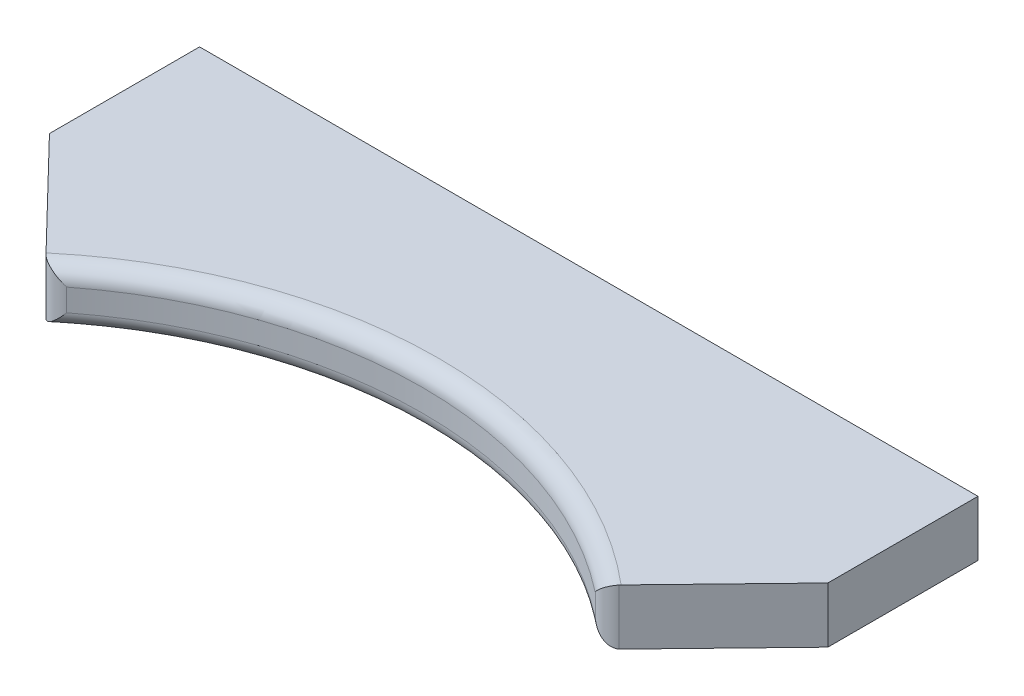
ISO-10303-21;
HEADER;
FILE_DESCRIPTION(('STEP AP214'),'2;1');
FILE_NAME('part.step','',(''),(''),'','','');
FILE_SCHEMA(('AUTOMOTIVE_DESIGN { 1 0 10303 214 1 1 1 1 }'));
ENDSEC;
DATA;
#1=APPLICATION_CONTEXT('core data for automotive mechanical design processes');
#2=APPLICATION_PROTOCOL_DEFINITION('international standard','automotive_design',2000,#1);
#3=PRODUCT_CONTEXT('',#1,'mechanical');
#4=PRODUCT('Part','Part','',(#3));
#5=PRODUCT_RELATED_PRODUCT_CATEGORY('part','',(#4));
#6=PRODUCT_DEFINITION_FORMATION('','',#4);
#7=PRODUCT_DEFINITION_CONTEXT('part definition',#1,'design');
#8=PRODUCT_DEFINITION('design','',#6,#7);
#9=PRODUCT_DEFINITION_SHAPE('','',#8);
#10=(LENGTH_UNIT() NAMED_UNIT(*) SI_UNIT(.MILLI.,.METRE.));
#11=(NAMED_UNIT(*) PLANE_ANGLE_UNIT() SI_UNIT($,.RADIAN.));
#12=(NAMED_UNIT(*) SI_UNIT($,.STERADIAN.) SOLID_ANGLE_UNIT());
#13=UNCERTAINTY_MEASURE_WITH_UNIT(LENGTH_MEASURE(1.E-05),#10,'distance_accuracy_value','');
#14=(GEOMETRIC_REPRESENTATION_CONTEXT(3) GLOBAL_UNCERTAINTY_ASSIGNED_CONTEXT((#13)) GLOBAL_UNIT_ASSIGNED_CONTEXT((#10,
#11,#12)) REPRESENTATION_CONTEXT('',''));
#15=CARTESIAN_POINT('',(0.,0.,0.));
#16=DIRECTION('',(0.,0.,1.));
#17=DIRECTION('',(1.,0.,0.));
#18=AXIS2_PLACEMENT_3D('',#15,#16,#17);
#19=CARTESIAN_POINT('',(-44.45,6.35,-68.072));
#20=DIRECTION('',(1.,0.,0.));
#21=DIRECTION('',(0.,0.,-1.));
#22=AXIS2_PLACEMENT_3D('',#19,#20,#21);
#23=PLANE('',#22);
#24=DIRECTION('',(0.,0.,1.));
#25=VECTOR('',#24,1.);
#26=CARTESIAN_POINT('',(-44.45,0.,-68.072));
#27=LINE('',#26,#25);
#28=CARTESIAN_POINT('',(-44.45,0.,-68.072));
#29=VERTEX_POINT('',#28);
#30=CARTESIAN_POINT('',(-44.45,0.,-50.927));
#31=VERTEX_POINT('',#30);
#32=EDGE_CURVE('E143',#29,#31,#27,.T.);
#33=ORIENTED_EDGE('',*,*,#32,.T.);
#34=DIRECTION('',(0.,-1.,0.));
#35=VECTOR('',#34,1.);
#36=CARTESIAN_POINT('',(-44.45,6.35,-50.927));
#37=LINE('',#36,#35);
#38=CARTESIAN_POINT('',(-44.45,6.35,-50.927));
#39=VERTEX_POINT('',#38);
#40=EDGE_CURVE('E124',#39,#31,#37,.T.);
#41=ORIENTED_EDGE('',*,*,#40,.F.);
#42=DIRECTION('',(0.,0.,1.));
#43=VECTOR('',#42,1.);
#44=CARTESIAN_POINT('',(-44.45,6.35,-68.072));
#45=LINE('',#44,#43);
#46=CARTESIAN_POINT('',(-44.45,6.35,-68.072));
#47=VERTEX_POINT('',#46);
#48=EDGE_CURVE('E131',#47,#39,#45,.T.);
#49=ORIENTED_EDGE('',*,*,#48,.F.);
#50=DIRECTION('',(0.,-1.,0.));
#51=VECTOR('',#50,1.);
#52=CARTESIAN_POINT('',(-44.45,6.35,-68.072));
#53=LINE('',#52,#51);
#54=EDGE_CURVE('E265',#47,#29,#53,.T.);
#55=ORIENTED_EDGE('',*,*,#54,.T.);
#56=EDGE_LOOP('',(#33,#41,#49,#55));
#57=FACE_BOUND('',#56,.T.);
#58=ADVANCED_FACE('F39',(#57),#23,.F.);
#59=CARTESIAN_POINT('',(-44.45,6.35,-50.927));
#60=DIRECTION('',(0.718690357158242,0.,-0.695330260040334));
#61=DIRECTION('',(-0.695330260040334,0.,-0.718690357158242));
#62=AXIS2_PLACEMENT_3D('',#59,#60,#61);
#63=PLANE('',#62);
#64=DIRECTION('',(0.695330260040334,0.,0.718690357158242));
#65=VECTOR('',#64,1.);
#66=CARTESIAN_POINT('',(-44.45,0.,-50.927));
#67=LINE('',#66,#65);
#68=CARTESIAN_POINT('',(-32.8385355418874,0.,-38.9254404273631));
#69=VERTEX_POINT('',#68);
#70=EDGE_CURVE('E252',#31,#69,#67,.T.);
#71=ORIENTED_EDGE('',*,*,#70,.T.);
#72=CARTESIAN_POINT('',(-32.8385355418874,0.,-38.9254404273631));
#73=CARTESIAN_POINT('',(-32.8192723699175,5.6676678392526E-07,-38.9055300959154));
#74=CARTESIAN_POINT('',(-32.8000273182367,0.000601240827206942,-38.8856384935203));
#75=CARTESIAN_POINT('',(-32.7615734555909,0.00300280352674082,-38.8458927469776));
#76=CARTESIAN_POINT('',(-32.7423646446257,0.0048036921572654,-38.8260386028297));
#77=CARTESIAN_POINT('',(-32.7231739539493,0.00720468807284279,-38.8062031877343));
#78=B_SPLINE_CURVE_WITH_KNOTS('',3,(#72,#73,#74,#75,#76,#77),.UNSPECIFIED.,.F.,.F.,(4,2,4),(0.,
0.0830522608019308,0.166104521009709),.UNSPECIFIED.);
#79=CARTESIAN_POINT('',(-32.7231739539493,0.00720468807284286,-38.8062031877343));
#80=VERTEX_POINT('',#79);
#81=EDGE_CURVE('E61',#69,#80,#78,.T.);
#82=ORIENTED_EDGE('',*,*,#81,.T.);
#83=DIRECTION('',(0.,-1.,0.));
#84=VECTOR('',#83,1.);
#85=CARTESIAN_POINT('',(-32.7231739539493,6.35,-38.8062031877343));
#86=LINE('',#85,#84);
#87=CARTESIAN_POINT('',(-32.7231739539493,6.34279531192716,-38.8062031877343));
#88=VERTEX_POINT('',#87);
#89=EDGE_CURVE('E65',#80,#88,#86,.F.);
#90=ORIENTED_EDGE('',*,*,#89,.T.);
#91=CARTESIAN_POINT('',(-32.7231739539493,6.34279531192716,-38.8062031877343));
#92=CARTESIAN_POINT('',(-32.7423646446257,6.34519630784273,-38.8260386028297));
#93=CARTESIAN_POINT('',(-32.7615734555909,6.34699719647326,-38.8458927469776));
#94=CARTESIAN_POINT('',(-32.8000273182367,6.34939875917279,-38.8856384935203));
#95=CARTESIAN_POINT('',(-32.8192723699175,6.34999943323322,-38.9055300959154));
#96=CARTESIAN_POINT('',(-32.8385355418874,6.35,-38.9254404273631));
#97=B_SPLINE_CURVE_WITH_KNOTS('',3,(#91,#92,#93,#94,#95,#96),.UNSPECIFIED.,.F.,.F.,(4,2,4),(0.,
0.0830522602077737,0.166104521009704),.UNSPECIFIED.);
#98=CARTESIAN_POINT('',(-32.8385355418874,6.35,-38.9254404273631));
#99=VERTEX_POINT('',#98);
#100=EDGE_CURVE('E127',#88,#99,#97,.T.);
#101=ORIENTED_EDGE('',*,*,#100,.T.);
#102=DIRECTION('',(0.695330260040334,0.,0.718690357158242));
#103=VECTOR('',#102,1.);
#104=CARTESIAN_POINT('',(-44.45,6.35,-50.927));
#105=LINE('',#104,#103);
#106=EDGE_CURVE('E120',#39,#99,#105,.T.);
#107=ORIENTED_EDGE('',*,*,#106,.F.);
#108=ORIENTED_EDGE('',*,*,#40,.T.);
#109=EDGE_LOOP('',(#71,#82,#90,#101,#107,#108));
#110=FACE_BOUND('',#109,.T.);
#111=ADVANCED_FACE('F122',(#110),#63,.F.);
#112=CARTESIAN_POINT('',(0.,6.35,0.));
#113=DIRECTION('',(0.,-1.,0.));
#114=DIRECTION('',(0.,0.,-1.));
#115=AXIS2_PLACEMENT_3D('',#112,#113,#114);
#116=CYLINDRICAL_SURFACE('',#115,49.022);
#117=DIRECTION('',(0.,-1.,0.));
#118=VECTOR('',#117,1.);
#119=CARTESIAN_POINT('',(-30.1812233563473,6.35,-38.6296549391045));
#120=LINE('',#119,#118);
#121=CARTESIAN_POINT('',(-30.1812233563472,4.445,-38.6296549391045));
#122=VERTEX_POINT('',#121);
#123=CARTESIAN_POINT('',(-30.1812233563472,1.905,-38.6296549391045));
#124=VERTEX_POINT('',#123);
#125=EDGE_CURVE('E232',#122,#124,#120,.T.);
#126=ORIENTED_EDGE('',*,*,#125,.T.);
#127=CARTESIAN_POINT('',(0.,1.905,0.));
#128=DIRECTION('',(0.,1.,0.));
#129=DIRECTION('',(0.,0.,1.));
#130=AXIS2_PLACEMENT_3D('',#127,#128,#129);
#131=CIRCLE('',#130,49.022);
#132=CARTESIAN_POINT('',(30.1812233563472,1.905,-38.6296549391045));
#133=VERTEX_POINT('',#132);
#134=EDGE_CURVE('E233',#124,#133,#131,.F.);
#135=ORIENTED_EDGE('',*,*,#134,.T.);
#136=DIRECTION('',(0.,-1.,0.));
#137=VECTOR('',#136,1.);
#138=CARTESIAN_POINT('',(30.1812233563472,6.35,-38.6296549391045));
#139=LINE('',#138,#137);
#140=CARTESIAN_POINT('',(30.1812233563472,4.445,-38.6296549391045));
#141=VERTEX_POINT('',#140);
#142=EDGE_CURVE('E221',#133,#141,#139,.F.);
#143=ORIENTED_EDGE('',*,*,#142,.T.);
#144=CARTESIAN_POINT('',(0.,4.445,0.));
#145=DIRECTION('',(0.,1.,0.));
#146=DIRECTION('',(0.,0.,1.));
#147=AXIS2_PLACEMENT_3D('',#144,#145,#146);
#148=CIRCLE('',#147,49.022);
#149=EDGE_CURVE('E181',#141,#122,#148,.T.);
#150=ORIENTED_EDGE('',*,*,#149,.T.);
#151=EDGE_LOOP('',(#126,#135,#143,#150));
#152=FACE_BOUND('',#151,.T.);
#153=ADVANCED_FACE('F169',(#152),#116,.F.);
#154=CARTESIAN_POINT('',(44.45,6.35,-50.927));
#155=DIRECTION('',(-0.718690357158241,0.,-0.695330260040335));
#156=DIRECTION('',(-0.695330260040335,0.,0.718690357158241));
#157=AXIS2_PLACEMENT_3D('',#154,#155,#156);
#158=PLANE('',#157);
#159=DIRECTION('',(0.,-1.,0.));
#160=VECTOR('',#159,1.);
#161=CARTESIAN_POINT('',(32.7231739539492,6.35,-38.8062031877343));
#162=LINE('',#161,#160);
#163=CARTESIAN_POINT('',(32.7231739539492,6.34279531192716,-38.8062031877343));
#164=VERTEX_POINT('',#163);
#165=CARTESIAN_POINT('',(32.7231739539492,0.00720468807284286,-38.8062031877343));
#166=VERTEX_POINT('',#165);
#167=EDGE_CURVE('E147',#164,#166,#162,.T.);
#168=ORIENTED_EDGE('',*,*,#167,.T.);
#169=CARTESIAN_POINT('',(32.7231739539492,0.00720468807284286,-38.8062031877343));
#170=CARTESIAN_POINT('',(32.7423646446256,0.00480369215726555,-38.8260386028297));
#171=CARTESIAN_POINT('',(32.7615734555909,0.00300280352674097,-38.8458927469776));
#172=CARTESIAN_POINT('',(32.8000273182367,0.000601240827206877,-38.8856384935203));
#173=CARTESIAN_POINT('',(32.8192723699175,5.66766783722193E-07,-38.9055300959154));
#174=CARTESIAN_POINT('',(32.8385355418874,0.,-38.9254404273631));
#175=B_SPLINE_CURVE_WITH_KNOTS('',3,(#169,#170,#171,#172,#173,#174),.UNSPECIFIED.,.F.,.F.,(4,2,
4),(0.,0.0830522602077737,0.166104521009705),.UNSPECIFIED.);
#176=CARTESIAN_POINT('',(32.8385355418874,0.,-38.9254404273631));
#177=VERTEX_POINT('',#176);
#178=EDGE_CURVE('E174',#166,#177,#175,.T.);
#179=ORIENTED_EDGE('',*,*,#178,.T.);
#180=DIRECTION('',(0.695330260040335,0.,-0.718690357158241));
#181=VECTOR('',#180,1.);
#182=CARTESIAN_POINT('',(44.45,0.,-50.927));
#183=LINE('',#182,#181);
#184=CARTESIAN_POINT('',(44.45,0.,-50.927));
#185=VERTEX_POINT('',#184);
#186=EDGE_CURVE('E254',#177,#185,#183,.T.);
#187=ORIENTED_EDGE('',*,*,#186,.T.);
#188=DIRECTION('',(0.,-1.,0.));
#189=VECTOR('',#188,1.);
#190=CARTESIAN_POINT('',(44.45,6.35,-50.927));
#191=LINE('',#190,#189);
#192=CARTESIAN_POINT('',(44.45,6.35,-50.927));
#193=VERTEX_POINT('',#192);
#194=EDGE_CURVE('E145',#193,#185,#191,.T.);
#195=ORIENTED_EDGE('',*,*,#194,.F.);
#196=DIRECTION('',(0.695330260040335,0.,-0.718690357158241));
#197=VECTOR('',#196,1.);
#198=CARTESIAN_POINT('',(44.45,6.35,-50.927));
#199=LINE('',#198,#197);
#200=CARTESIAN_POINT('',(32.8385355418874,6.35,-38.9254404273631));
#201=VERTEX_POINT('',#200);
#202=EDGE_CURVE('E130',#201,#193,#199,.T.);
#203=ORIENTED_EDGE('',*,*,#202,.F.);
#204=CARTESIAN_POINT('',(32.8385355418874,6.35,-38.9254404273631));
#205=CARTESIAN_POINT('',(32.8192723699175,6.34999943323322,-38.9055300959154));
#206=CARTESIAN_POINT('',(32.8000273182367,6.34939875917279,-38.8856384935203));
#207=CARTESIAN_POINT('',(32.7615734555909,6.34699719647326,-38.8458927469776));
#208=CARTESIAN_POINT('',(32.7423646446256,6.34519630784273,-38.8260386028297));
#209=CARTESIAN_POINT('',(32.7231739539492,6.34279531192716,-38.8062031877343));
#210=B_SPLINE_CURVE_WITH_KNOTS('',3,(#204,#205,#206,#207,#208,#209),.UNSPECIFIED.,.F.,.F.,(4,2,
4),(0.,0.0830522608019308,0.166104521009705),.UNSPECIFIED.);
#211=EDGE_CURVE('E144',#201,#164,#210,.T.);
#212=ORIENTED_EDGE('',*,*,#211,.T.);
#213=EDGE_LOOP('',(#168,#179,#187,#195,#203,#212));
#214=FACE_BOUND('',#213,.T.);
#215=ADVANCED_FACE('F163',(#214),#158,.F.);
#216=CARTESIAN_POINT('',(44.45,6.35,-68.072));
#217=DIRECTION('',(-1.,0.,0.));
#218=DIRECTION('',(0.,0.,1.));
#219=AXIS2_PLACEMENT_3D('',#216,#217,#218);
#220=PLANE('',#219);
#221=DIRECTION('',(0.,0.,-1.));
#222=VECTOR('',#221,1.);
#223=CARTESIAN_POINT('',(44.45,0.,-68.072));
#224=LINE('',#223,#222);
#225=CARTESIAN_POINT('',(44.45,0.,-68.072));
#226=VERTEX_POINT('',#225);
#227=EDGE_CURVE('E270',#185,#226,#224,.T.);
#228=ORIENTED_EDGE('',*,*,#227,.T.);
#229=DIRECTION('',(0.,-1.,0.));
#230=VECTOR('',#229,1.);
#231=CARTESIAN_POINT('',(44.45,6.35,-68.072));
#232=LINE('',#231,#230);
#233=CARTESIAN_POINT('',(44.45,6.35,-68.072));
#234=VERTEX_POINT('',#233);
#235=EDGE_CURVE('E150',#234,#226,#232,.T.);
#236=ORIENTED_EDGE('',*,*,#235,.F.);
#237=DIRECTION('',(0.,0.,-1.));
#238=VECTOR('',#237,1.);
#239=CARTESIAN_POINT('',(44.45,6.35,-68.072));
#240=LINE('',#239,#238);
#241=EDGE_CURVE('E259',#193,#234,#240,.T.);
#242=ORIENTED_EDGE('',*,*,#241,.F.);
#243=ORIENTED_EDGE('',*,*,#194,.T.);
#244=EDGE_LOOP('',(#228,#236,#242,#243));
#245=FACE_BOUND('',#244,.T.);
#246=ADVANCED_FACE('F168',(#245),#220,.F.);
#247=CARTESIAN_POINT('',(-44.45,6.35,-68.072));
#248=DIRECTION('',(0.,0.,1.));
#249=DIRECTION('',(1.,0.,0.));
#250=AXIS2_PLACEMENT_3D('',#247,#248,#249);
#251=PLANE('',#250);
#252=DIRECTION('',(-1.,0.,0.));
#253=VECTOR('',#252,1.);
#254=CARTESIAN_POINT('',(-44.45,0.,-68.072));
#255=LINE('',#254,#253);
#256=EDGE_CURVE('E140',#226,#29,#255,.T.);
#257=ORIENTED_EDGE('',*,*,#256,.T.);
#258=ORIENTED_EDGE('',*,*,#54,.F.);
#259=DIRECTION('',(-1.,0.,0.));
#260=VECTOR('',#259,1.);
#261=CARTESIAN_POINT('',(-44.45,6.35,-68.072));
#262=LINE('',#261,#260);
#263=EDGE_CURVE('E136',#234,#47,#262,.T.);
#264=ORIENTED_EDGE('',*,*,#263,.F.);
#265=ORIENTED_EDGE('',*,*,#235,.T.);
#266=EDGE_LOOP('',(#257,#258,#264,#265));
#267=FACE_BOUND('',#266,.T.);
#268=ADVANCED_FACE('F275',(#267),#251,.F.);
#269=CARTESIAN_POINT('',(0.,6.35,0.));
#270=DIRECTION('',(0.,1.,0.));
#271=DIRECTION('',(0.,0.,1.));
#272=AXIS2_PLACEMENT_3D('',#269,#270,#271);
#273=PLANE('',#272);
#274=ORIENTED_EDGE('',*,*,#106,.T.);
#275=CARTESIAN_POINT('',(0.,6.35,0.));
#276=DIRECTION('',(0.,1.,0.));
#277=DIRECTION('',(0.,0.,1.));
#278=AXIS2_PLACEMENT_3D('',#275,#276,#277);
#279=CIRCLE('',#278,50.927);
#280=EDGE_CURVE('E11',#99,#201,#279,.F.);
#281=ORIENTED_EDGE('',*,*,#280,.T.);
#282=ORIENTED_EDGE('',*,*,#202,.T.);
#283=ORIENTED_EDGE('',*,*,#241,.T.);
#284=ORIENTED_EDGE('',*,*,#263,.T.);
#285=ORIENTED_EDGE('',*,*,#48,.T.);
#286=EDGE_LOOP('',(#274,#281,#282,#283,#284,#285));
#287=FACE_BOUND('',#286,.T.);
#288=ADVANCED_FACE('F134',(#287),#273,.T.);
#289=CARTESIAN_POINT('',(0.,0.,0.));
#290=DIRECTION('',(0.,1.,0.));
#291=DIRECTION('',(0.,0.,1.));
#292=AXIS2_PLACEMENT_3D('',#289,#290,#291);
#293=PLANE('',#292);
#294=ORIENTED_EDGE('',*,*,#186,.F.);
#295=CARTESIAN_POINT('',(0.,0.,0.));
#296=DIRECTION('',(0.,1.,0.));
#297=DIRECTION('',(0.,0.,1.));
#298=AXIS2_PLACEMENT_3D('',#295,#296,#297);
#299=CIRCLE('',#298,50.927);
#300=EDGE_CURVE('E53',#177,#69,#299,.T.);
#301=ORIENTED_EDGE('',*,*,#300,.T.);
#302=ORIENTED_EDGE('',*,*,#70,.F.);
#303=ORIENTED_EDGE('',*,*,#32,.F.);
#304=ORIENTED_EDGE('',*,*,#256,.F.);
#305=ORIENTED_EDGE('',*,*,#227,.F.);
#306=EDGE_LOOP('',(#294,#301,#302,#303,#304,#305));
#307=FACE_BOUND('',#306,.T.);
#308=ADVANCED_FACE('F251',(#307),#293,.F.);
#309=CARTESIAN_POINT('',(-31.3540688235628,6.35,-40.1308073331111));
#310=DIRECTION('',(0.,-1.,0.));
#311=DIRECTION('',(0.,0.,-1.));
#312=AXIS2_PLACEMENT_3D('',#309,#310,#311);
#313=CYLINDRICAL_SURFACE('',#312,1.905);
#314=CARTESIAN_POINT('',(-32.7231739539493,0.00720468807284279,-38.8062031877343));
#315=CARTESIAN_POINT('',(-32.6920063368148,0.0110947390108296,-38.7739725316681));
#316=CARTESIAN_POINT('',(-32.659793653122,0.0165774536494739,-38.7429692827534));
#317=CARTESIAN_POINT('',(-32.5936835095236,0.0305537951428703,-38.6836239055784));
#318=CARTESIAN_POINT('',(-32.5597880444021,0.0390439269484504,-38.6552787364063));
#319=CARTESIAN_POINT('',(-32.4909752829972,0.0587754199974511,-38.6016387668672));
#320=CARTESIAN_POINT('',(-32.4560709009103,0.0699896204273844,-38.576317324012));
#321=CARTESIAN_POINT('',(-32.3852795625632,0.0949908711429152,-38.5284788359678));
#322=CARTESIAN_POINT('',(-32.3493923596191,0.108778572511388,-38.5059625028666));
#323=CARTESIAN_POINT('',(-32.2410779413365,0.153518357651862,-38.4428538057678));
#324=CARTESIAN_POINT('',(-32.16762190838,0.187957854259799,-38.4064134977955));
#325=CARTESIAN_POINT('',(-32.0199892766425,0.264318591122208,-38.3441816276178));
#326=CARTESIAN_POINT('',(-31.9458112706178,0.306259718305417,-38.318418989453));
#327=CARTESIAN_POINT('',(-31.7612297942652,0.418427230494298,-38.2662724733993));
#328=CARTESIAN_POINT('',(-31.6512933525135,0.49229826272579,-38.2460419723139));
#329=CARTESIAN_POINT('',(-31.4359289724045,0.648832650697227,-38.2244785255567));
#330=CARTESIAN_POINT('',(-31.3305120400018,0.731515930404953,-38.2231893589062));
#331=CARTESIAN_POINT('',(-31.0855810010597,0.936175475359487,-38.2394222745389));
#332=CARTESIAN_POINT('',(-30.9488485876341,1.06087593759237,-38.264495595386));
#333=CARTESIAN_POINT('',(-30.6891754261752,1.31602296870952,-38.3404871764293));
#334=CARTESIAN_POINT('',(-30.5662277527137,1.44646660594033,-38.3913923870493));
#335=CARTESIAN_POINT('',(-30.3574665900346,1.68449940625387,-38.5038431298032));
#336=CARTESIAN_POINT('',(-30.2690544358175,1.7916713210128,-38.5614728837672));
#337=CARTESIAN_POINT('',(-30.1844369551141,1.90084598668089,-38.6271483197868));
#338=CARTESIAN_POINT('',(-30.1828291374652,1.90292301044939,-38.6284003534224));
#339=CARTESIAN_POINT('',(-30.1812233563472,1.905,-38.6296549391045));
#340=B_SPLINE_CURVE_WITH_KNOTS('',3,(#314,#315,#316,#317,#318,#319,#320,#321,#322,#323,#324,
#325,#326,#327,#328,#329,#330,#331,#332,#333,#334,#335,#336,#337,#338,#339),.UNSPECIFIED.,.F.,
.F.,(4,2,2,2,2,2,2,2,2,2,2,2,4),(0.,0.134930053809494,0.269703811282335,0.403185287206636,
0.536700579163399,0.802290505191934,1.06859524107558,1.46829930358115,1.86892705534472,
2.42617905646227,2.98314982867923,3.43325110581988,3.44198037246863),.UNSPECIFIED.);
#341=EDGE_CURVE('E201',#124,#80,#340,.F.);
#342=ORIENTED_EDGE('',*,*,#341,.F.);
#343=ORIENTED_EDGE('',*,*,#125,.F.);
#344=CARTESIAN_POINT('',(-32.7231739539493,6.34279531192716,-38.8062031877343));
#345=CARTESIAN_POINT('',(-32.6920063368148,6.33890526098917,-38.7739725316681));
#346=CARTESIAN_POINT('',(-32.659793653122,6.33342254635053,-38.7429692827534));
#347=CARTESIAN_POINT('',(-32.5936835095236,6.31944620485713,-38.6836239055784));
#348=CARTESIAN_POINT('',(-32.5597880444021,6.31095607305155,-38.6552787364063));
#349=CARTESIAN_POINT('',(-32.4909752829972,6.29122458000255,-38.6016387668672));
#350=CARTESIAN_POINT('',(-32.4560709009103,6.28001037957261,-38.576317324012));
#351=CARTESIAN_POINT('',(-32.3852795625632,6.25500912885708,-38.5284788359678));
#352=CARTESIAN_POINT('',(-32.3493923596191,6.24122142748861,-38.5059625028666));
#353=CARTESIAN_POINT('',(-32.2410779413365,6.19648164234814,-38.4428538057678));
#354=CARTESIAN_POINT('',(-32.16762190838,6.1620421457402,-38.4064134977955));
#355=CARTESIAN_POINT('',(-32.0199892766425,6.08568140887779,-38.3441816276178));
#356=CARTESIAN_POINT('',(-31.9458112706178,6.04374028169458,-38.318418989453));
#357=CARTESIAN_POINT('',(-31.7612297942652,5.9315727695057,-38.2662724733993));
#358=CARTESIAN_POINT('',(-31.6512933525134,5.85770173727421,-38.2460419723139));
#359=CARTESIAN_POINT('',(-31.4359289724045,5.70116734930277,-38.2244785255567));
#360=CARTESIAN_POINT('',(-31.3305120400018,5.61848406959505,-38.2231893589062));
#361=CARTESIAN_POINT('',(-31.0855810010597,5.41382452464051,-38.2394222745389));
#362=CARTESIAN_POINT('',(-30.9488485876341,5.28912406240763,-38.264495595386));
#363=CARTESIAN_POINT('',(-30.6891754261752,5.03397703129048,-38.3404871764293));
#364=CARTESIAN_POINT('',(-30.5662277527137,4.90353339405967,-38.3913923870493));
#365=CARTESIAN_POINT('',(-30.3574665900346,4.66550059374612,-38.5038431298032));
#366=CARTESIAN_POINT('',(-30.2690544358175,4.55832867898719,-38.5614728837672));
#367=CARTESIAN_POINT('',(-30.1844369551141,4.4491540133191,-38.6271483197868));
#368=CARTESIAN_POINT('',(-30.1828291374652,4.44707698955061,-38.6284003534224));
#369=CARTESIAN_POINT('',(-30.1812233563472,4.445,-38.6296549391045));
#370=B_SPLINE_CURVE_WITH_KNOTS('',3,(#344,#345,#346,#347,#348,#349,#350,#351,#352,#353,#354,
#355,#356,#357,#358,#359,#360,#361,#362,#363,#364,#365,#366,#367,#368,#369),.UNSPECIFIED.,.F.,
.F.,(4,2,2,2,2,2,2,2,2,2,2,2,4),(0.,0.134930053809494,0.269703811282335,0.403185287206636,
0.536700579163399,0.802290505191934,1.06859524107558,1.46829930358116,1.86892705534472,
2.42617905646226,2.98314982867923,3.43325110581988,3.44198037246863),.UNSPECIFIED.);
#371=EDGE_CURVE('E44',#88,#122,#370,.T.);
#372=ORIENTED_EDGE('',*,*,#371,.F.);
#373=ORIENTED_EDGE('',*,*,#89,.F.);
#374=EDGE_LOOP('',(#342,#343,#372,#373));
#375=FACE_BOUND('',#374,.T.);
#376=ADVANCED_FACE('F41',(#375),#313,.T.);
#377=CARTESIAN_POINT('',(0.,4.445,0.));
#378=DIRECTION('',(0.,1.,0.));
#379=DIRECTION('',(0.,0.,1.));
#380=AXIS2_PLACEMENT_3D('',#377,#378,#379);
#381=TOROIDAL_SURFACE('',#380,50.927,1.905);
#382=ORIENTED_EDGE('',*,*,#371,.T.);
#383=ORIENTED_EDGE('',*,*,#149,.F.);
#384=CARTESIAN_POINT('',(32.7231739539492,6.34279531192716,-38.8062031877343));
#385=CARTESIAN_POINT('',(32.6920063368148,6.33890526098917,-38.7739725316681));
#386=CARTESIAN_POINT('',(32.659793653122,6.33342254635053,-38.7429692827534));
#387=CARTESIAN_POINT('',(32.5936835095236,6.31944620485713,-38.6836239055784));
#388=CARTESIAN_POINT('',(32.5597880444021,6.31095607305155,-38.6552787364064));
#389=CARTESIAN_POINT('',(32.4909752829972,6.29122458000255,-38.6016387668672));
#390=CARTESIAN_POINT('',(32.4560709009103,6.28001037957261,-38.576317324012));
#391=CARTESIAN_POINT('',(32.3852795625632,6.25500912885708,-38.5284788359678));
#392=CARTESIAN_POINT('',(32.3493923596191,6.24122142748861,-38.5059625028666));
#393=CARTESIAN_POINT('',(32.2410779413364,6.19648164234814,-38.4428538057678));
#394=CARTESIAN_POINT('',(32.16762190838,6.1620421457402,-38.4064134977956));
#395=CARTESIAN_POINT('',(32.0199892766425,6.08568140887779,-38.3441816276178));
#396=CARTESIAN_POINT('',(31.9458112706178,6.04374028169459,-38.318418989453));
#397=CARTESIAN_POINT('',(31.7612297942652,5.93157276950568,-38.2662724733993));
#398=CARTESIAN_POINT('',(31.6512933525135,5.85770173727411,-38.2460419723138));
#399=CARTESIAN_POINT('',(31.4359289724044,5.70116734930288,-38.2244785255568));
#400=CARTESIAN_POINT('',(31.3305120400015,5.61848406959543,-38.2231893589065));
#401=CARTESIAN_POINT('',(31.0855810010601,5.41382452463997,-38.2394222745386));
#402=CARTESIAN_POINT('',(30.9488485876359,5.28912406240527,-38.2644955953845));
#403=CARTESIAN_POINT('',(30.6891754261732,5.0339770312928,-38.3404871764308));
#404=CARTESIAN_POINT('',(30.5662277527066,4.90353339406849,-38.3913923870548));
#405=CARTESIAN_POINT('',(30.3574665900404,4.66550059373896,-38.5038431297987));
#406=CARTESIAN_POINT('',(30.2690544358371,4.55832867896286,-38.5614728837521));
#407=CARTESIAN_POINT('',(30.1844369551148,4.44915401331817,-38.6271483197862));
#408=CARTESIAN_POINT('',(30.1828291374656,4.44707698955013,-38.6284003534221));
#409=CARTESIAN_POINT('',(30.1812233563472,4.445,-38.6296549391045));
#410=B_SPLINE_CURVE_WITH_KNOTS('',3,(#384,#385,#386,#387,#388,#389,#390,#391,#392,#393,#394,
#395,#396,#397,#398,#399,#400,#401,#402,#403,#404,#405,#406,#407,#408,#409),.UNSPECIFIED.,.F.,
.F.,(4,2,2,2,2,2,2,2,2,2,2,2,4),(0.,0.134930053809494,0.269703811282325,0.403185287206636,
0.536700579163399,0.802290505191934,1.06859524107559,1.46829930358114,1.86892705534471,
2.4261790564623,2.98314982867923,3.43325110581988,3.44198037246863),.UNSPECIFIED.);
#411=EDGE_CURVE('E207',#164,#141,#410,.T.);
#412=ORIENTED_EDGE('',*,*,#411,.F.);
#413=ORIENTED_EDGE('',*,*,#211,.F.);
#414=ORIENTED_EDGE('',*,*,#280,.F.);
#415=ORIENTED_EDGE('',*,*,#100,.F.);
#416=EDGE_LOOP('',(#382,#383,#412,#413,#414,#415));
#417=FACE_BOUND('',#416,.T.);
#418=ADVANCED_FACE('F160',(#417),#381,.T.);
#419=CARTESIAN_POINT('',(0.,1.905,0.));
#420=DIRECTION('',(0.,1.,0.));
#421=DIRECTION('',(0.,0.,1.));
#422=AXIS2_PLACEMENT_3D('',#419,#420,#421);
#423=TOROIDAL_SURFACE('',#422,50.927,1.905);
#424=ORIENTED_EDGE('',*,*,#300,.F.);
#425=ORIENTED_EDGE('',*,*,#178,.F.);
#426=CARTESIAN_POINT('',(32.7231739539492,0.00720468807284321,-38.8062031877343));
#427=CARTESIAN_POINT('',(32.6920063368148,0.0110947390108312,-38.7739725316681));
#428=CARTESIAN_POINT('',(32.659793653122,0.0165774536494756,-38.7429692827534));
#429=CARTESIAN_POINT('',(32.5936835095236,0.0305537951428715,-38.6836239055784));
#430=CARTESIAN_POINT('',(32.5597880444021,0.0390439269484506,-38.6552787364064));
#431=CARTESIAN_POINT('',(32.4909752829972,0.0587754199974522,-38.6016387668672));
#432=CARTESIAN_POINT('',(32.4560709009103,0.0699896204273876,-38.576317324012));
#433=CARTESIAN_POINT('',(32.3852795625632,0.0949908711429192,-38.5284788359678));
#434=CARTESIAN_POINT('',(32.3493923596191,0.108778572511391,-38.5059625028666));
#435=CARTESIAN_POINT('',(32.2410779413364,0.153518357651862,-38.4428538057678));
#436=CARTESIAN_POINT('',(32.16762190838,0.187957854259801,-38.4064134977956));
#437=CARTESIAN_POINT('',(32.0199892766425,0.264318591122209,-38.3441816276178));
#438=CARTESIAN_POINT('',(31.9458112706178,0.306259718305415,-38.318418989453));
#439=CARTESIAN_POINT('',(31.7612297942652,0.418427230494309,-38.2662724733994));
#440=CARTESIAN_POINT('',(31.6512933525135,0.492298262725828,-38.2460419723139));
#441=CARTESIAN_POINT('',(31.4359289724045,0.648832650697186,-38.2244785255567));
#442=CARTESIAN_POINT('',(31.3305120400017,0.731515930404806,-38.2231893589063));
#443=CARTESIAN_POINT('',(31.0855810010599,0.936175475359699,-38.2394222745388));
#444=CARTESIAN_POINT('',(30.9488485876348,1.06087593759329,-38.2644955953854));
#445=CARTESIAN_POINT('',(30.6891754261744,1.31602296870864,-38.3404871764299));
#446=CARTESIAN_POINT('',(30.566227752711,1.44646660593695,-38.3913923870514));
#447=CARTESIAN_POINT('',(30.3574665900368,1.68449940625666,-38.5038431298014));
#448=CARTESIAN_POINT('',(30.2690544358251,1.79167132102221,-38.5614728837614));
#449=CARTESIAN_POINT('',(30.1844369551144,1.90084598668126,-38.6271483197865));
#450=CARTESIAN_POINT('',(30.1828291374653,1.90292301044958,-38.6284003534223));
#451=CARTESIAN_POINT('',(30.1812233563472,1.905,-38.6296549391045));
#452=B_SPLINE_CURVE_WITH_KNOTS('',3,(#426,#427,#428,#429,#430,#431,#432,#433,#434,#435,#436,
#437,#438,#439,#440,#441,#442,#443,#444,#445,#446,#447,#448,#449,#450,#451),.UNSPECIFIED.,.F.,
.F.,(4,2,2,2,2,2,2,2,2,2,2,2,4),(0.,0.134930053809504,0.269703811282335,0.403185287206636,
0.536700579163399,0.802290505191934,1.06859524107559,1.46829930358115,1.86892705534472,
2.42617905646228,2.98314982867925,3.43325110581988,3.44198037246863),.UNSPECIFIED.);
#453=EDGE_CURVE('E193',#133,#166,#452,.F.);
#454=ORIENTED_EDGE('',*,*,#453,.F.);
#455=ORIENTED_EDGE('',*,*,#134,.F.);
#456=ORIENTED_EDGE('',*,*,#341,.T.);
#457=ORIENTED_EDGE('',*,*,#81,.F.);
#458=EDGE_LOOP('',(#424,#425,#454,#455,#456,#457));
#459=FACE_BOUND('',#458,.T.);
#460=ADVANCED_FACE('F183',(#459),#423,.T.);
#461=CARTESIAN_POINT('',(31.3540688235628,6.35,-40.1308073331111));
#462=DIRECTION('',(0.,-1.,0.));
#463=DIRECTION('',(0.,0.,-1.));
#464=AXIS2_PLACEMENT_3D('',#461,#462,#463);
#465=CYLINDRICAL_SURFACE('',#464,1.905);
#466=ORIENTED_EDGE('',*,*,#411,.T.);
#467=ORIENTED_EDGE('',*,*,#142,.F.);
#468=ORIENTED_EDGE('',*,*,#453,.T.);
#469=ORIENTED_EDGE('',*,*,#167,.F.);
#470=EDGE_LOOP('',(#466,#467,#468,#469));
#471=FACE_BOUND('',#470,.T.);
#472=ADVANCED_FACE('F187',(#471),#465,.T.);
#473=CLOSED_SHELL('',(#58,#111,#153,#215,#246,#268,#288,#308,#376,#418,#460,#472));
#474=MANIFOLD_SOLID_BREP('B2',#473);
#475=ADVANCED_BREP_SHAPE_REPRESENTATION('',(#18,#474),#14);
#476=SHAPE_DEFINITION_REPRESENTATION(#9,#475);
ENDSEC;
END-ISO-10303-21;
